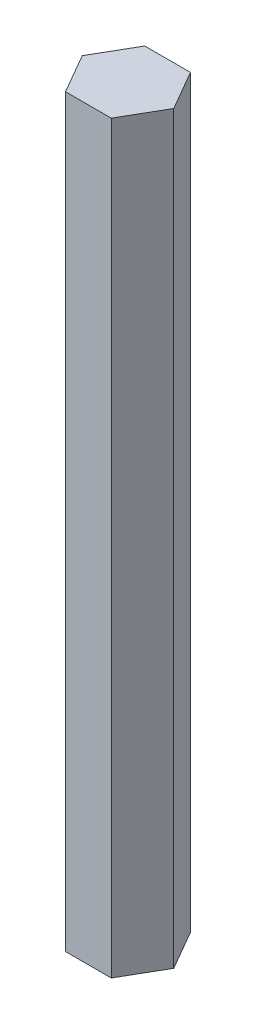
ISO-10303-21;
HEADER;
FILE_DESCRIPTION(('STEP AP214'),'2;1');
FILE_NAME('part.step','',(''),(''),'','','');
FILE_SCHEMA(('AUTOMOTIVE_DESIGN { 1 0 10303 214 1 1 1 1 }'));
ENDSEC;
DATA;
#1=APPLICATION_CONTEXT('core data for automotive mechanical design processes');
#2=APPLICATION_PROTOCOL_DEFINITION('international standard','automotive_design',2000,#1);
#3=PRODUCT_CONTEXT('',#1,'mechanical');
#4=PRODUCT('Part','Part','',(#3));
#5=PRODUCT_RELATED_PRODUCT_CATEGORY('part','',(#4));
#6=PRODUCT_DEFINITION_FORMATION('','',#4);
#7=PRODUCT_DEFINITION_CONTEXT('part definition',#1,'design');
#8=PRODUCT_DEFINITION('design','',#6,#7);
#9=PRODUCT_DEFINITION_SHAPE('','',#8);
#10=(LENGTH_UNIT() NAMED_UNIT(*) SI_UNIT(.MILLI.,.METRE.));
#11=(NAMED_UNIT(*) PLANE_ANGLE_UNIT() SI_UNIT($,.RADIAN.));
#12=(NAMED_UNIT(*) SI_UNIT($,.STERADIAN.) SOLID_ANGLE_UNIT());
#13=UNCERTAINTY_MEASURE_WITH_UNIT(LENGTH_MEASURE(1.E-05),#10,'distance_accuracy_value','');
#14=(GEOMETRIC_REPRESENTATION_CONTEXT(3) GLOBAL_UNCERTAINTY_ASSIGNED_CONTEXT((#13)) GLOBAL_UNIT_ASSIGNED_CONTEXT((#10,
#11,#12)) REPRESENTATION_CONTEXT('',''));
#15=CARTESIAN_POINT('',(0.,0.,0.));
#16=DIRECTION('',(0.,0.,1.));
#17=DIRECTION('',(1.,0.,0.));
#18=AXIS2_PLACEMENT_3D('',#15,#16,#17);
#19=CARTESIAN_POINT('',(2.88675134594813,47.,0.));
#20=DIRECTION('',(-0.866025403784438,0.,0.5));
#21=DIRECTION('',(0.5,0.,0.866025403784439));
#22=AXIS2_PLACEMENT_3D('',#19,#20,#21);
#23=PLANE('',#22);
#24=DIRECTION('',(-0.5,0.,-0.866025403784438));
#25=VECTOR('',#24,1.);
#26=CARTESIAN_POINT('',(2.88675134594813,0.,0.));
#27=LINE('',#26,#25);
#28=CARTESIAN_POINT('',(2.88675134594813,0.,0.));
#29=VERTEX_POINT('',#28);
#30=CARTESIAN_POINT('',(1.44337567297406,0.,-2.5));
#31=VERTEX_POINT('',#30);
#32=EDGE_CURVE('E134',#29,#31,#27,.T.);
#33=ORIENTED_EDGE('',*,*,#32,.T.);
#34=DIRECTION('',(0.,-1.,0.));
#35=VECTOR('',#34,1.);
#36=CARTESIAN_POINT('',(1.44337567297406,47.,-2.5));
#37=LINE('',#36,#35);
#38=CARTESIAN_POINT('',(1.44337567297406,47.,-2.5));
#39=VERTEX_POINT('',#38);
#40=EDGE_CURVE('E11',#39,#31,#37,.T.);
#41=ORIENTED_EDGE('',*,*,#40,.F.);
#42=DIRECTION('',(-0.5,0.,-0.866025403784438));
#43=VECTOR('',#42,1.);
#44=CARTESIAN_POINT('',(2.88675134594813,47.,0.));
#45=LINE('',#44,#43);
#46=CARTESIAN_POINT('',(2.88675134594813,47.,0.));
#47=VERTEX_POINT('',#46);
#48=EDGE_CURVE('E150',#47,#39,#45,.T.);
#49=ORIENTED_EDGE('',*,*,#48,.F.);
#50=DIRECTION('',(0.,-1.,0.));
#51=VECTOR('',#50,1.);
#52=CARTESIAN_POINT('',(2.88675134594813,47.,0.));
#53=LINE('',#52,#51);
#54=EDGE_CURVE('E130',#47,#29,#53,.T.);
#55=ORIENTED_EDGE('',*,*,#54,.T.);
#56=EDGE_LOOP('',(#33,#41,#49,#55));
#57=FACE_BOUND('',#56,.T.);
#58=ADVANCED_FACE('F45',(#57),#23,.F.);
#59=CARTESIAN_POINT('',(1.44337567297406,47.,-2.5));
#60=DIRECTION('',(0.,0.,1.));
#61=DIRECTION('',(1.,0.,0.));
#62=AXIS2_PLACEMENT_3D('',#59,#60,#61);
#63=PLANE('',#62);
#64=DIRECTION('',(-1.,0.,0.));
#65=VECTOR('',#64,1.);
#66=CARTESIAN_POINT('',(1.44337567297406,0.,-2.5));
#67=LINE('',#66,#65);
#68=CARTESIAN_POINT('',(-1.44337567297406,0.,-2.5));
#69=VERTEX_POINT('',#68);
#70=EDGE_CURVE('E138',#31,#69,#67,.T.);
#71=ORIENTED_EDGE('',*,*,#70,.T.);
#72=DIRECTION('',(0.,-1.,0.));
#73=VECTOR('',#72,1.);
#74=CARTESIAN_POINT('',(-1.44337567297406,47.,-2.5));
#75=LINE('',#74,#73);
#76=CARTESIAN_POINT('',(-1.44337567297406,47.,-2.5));
#77=VERTEX_POINT('',#76);
#78=EDGE_CURVE('E54',#77,#69,#75,.T.);
#79=ORIENTED_EDGE('',*,*,#78,.F.);
#80=DIRECTION('',(-1.,0.,0.));
#81=VECTOR('',#80,1.);
#82=CARTESIAN_POINT('',(1.44337567297406,47.,-2.5));
#83=LINE('',#82,#81);
#84=EDGE_CURVE('E99',#39,#77,#83,.T.);
#85=ORIENTED_EDGE('',*,*,#84,.F.);
#86=ORIENTED_EDGE('',*,*,#40,.T.);
#87=EDGE_LOOP('',(#71,#79,#85,#86));
#88=FACE_BOUND('',#87,.T.);
#89=ADVANCED_FACE('F178',(#88),#63,.F.);
#90=CARTESIAN_POINT('',(-1.44337567297406,47.,-2.5));
#91=DIRECTION('',(0.866025403784439,0.,0.5));
#92=DIRECTION('',(0.5,0.,-0.866025403784439));
#93=AXIS2_PLACEMENT_3D('',#90,#91,#92);
#94=PLANE('',#93);
#95=DIRECTION('',(-0.5,0.,0.866025403784439));
#96=VECTOR('',#95,1.);
#97=CARTESIAN_POINT('',(-1.44337567297406,0.,-2.5));
#98=LINE('',#97,#96);
#99=CARTESIAN_POINT('',(-2.88675134594813,0.,0.));
#100=VERTEX_POINT('',#99);
#101=EDGE_CURVE('E141',#69,#100,#98,.T.);
#102=ORIENTED_EDGE('',*,*,#101,.T.);
#103=DIRECTION('',(0.,-1.,0.));
#104=VECTOR('',#103,1.);
#105=CARTESIAN_POINT('',(-2.88675134594813,47.,0.));
#106=LINE('',#105,#104);
#107=CARTESIAN_POINT('',(-2.88675134594813,47.,0.));
#108=VERTEX_POINT('',#107);
#109=EDGE_CURVE('E123',#108,#100,#106,.T.);
#110=ORIENTED_EDGE('',*,*,#109,.F.);
#111=DIRECTION('',(-0.5,0.,0.866025403784439));
#112=VECTOR('',#111,1.);
#113=CARTESIAN_POINT('',(-1.44337567297406,47.,-2.5));
#114=LINE('',#113,#112);
#115=EDGE_CURVE('E112',#77,#108,#114,.T.);
#116=ORIENTED_EDGE('',*,*,#115,.F.);
#117=ORIENTED_EDGE('',*,*,#78,.T.);
#118=EDGE_LOOP('',(#102,#110,#116,#117));
#119=FACE_BOUND('',#118,.T.);
#120=ADVANCED_FACE('F160',(#119),#94,.F.);
#121=CARTESIAN_POINT('',(-2.88675134594813,47.,0.));
#122=DIRECTION('',(0.866025403784438,0.,-0.5));
#123=DIRECTION('',(-0.5,0.,-0.866025403784439));
#124=AXIS2_PLACEMENT_3D('',#121,#122,#123);
#125=PLANE('',#124);
#126=DIRECTION('',(0.5,0.,0.866025403784438));
#127=VECTOR('',#126,1.);
#128=CARTESIAN_POINT('',(-2.88675134594813,0.,0.));
#129=LINE('',#128,#127);
#130=CARTESIAN_POINT('',(-1.44337567297406,0.,2.5));
#131=VERTEX_POINT('',#130);
#132=EDGE_CURVE('E121',#100,#131,#129,.T.);
#133=ORIENTED_EDGE('',*,*,#132,.T.);
#134=DIRECTION('',(0.,-1.,0.));
#135=VECTOR('',#134,1.);
#136=CARTESIAN_POINT('',(-1.44337567297406,47.,2.5));
#137=LINE('',#136,#135);
#138=CARTESIAN_POINT('',(-1.44337567297406,47.,2.5));
#139=VERTEX_POINT('',#138);
#140=EDGE_CURVE('E118',#139,#131,#137,.T.);
#141=ORIENTED_EDGE('',*,*,#140,.F.);
#142=DIRECTION('',(0.5,0.,0.866025403784438));
#143=VECTOR('',#142,1.);
#144=CARTESIAN_POINT('',(-2.88675134594813,47.,0.));
#145=LINE('',#144,#143);
#146=EDGE_CURVE('E106',#108,#139,#145,.T.);
#147=ORIENTED_EDGE('',*,*,#146,.F.);
#148=ORIENTED_EDGE('',*,*,#109,.T.);
#149=EDGE_LOOP('',(#133,#141,#147,#148));
#150=FACE_BOUND('',#149,.T.);
#151=ADVANCED_FACE('F119',(#150),#125,.F.);
#152=CARTESIAN_POINT('',(-1.44337567297406,47.,2.5));
#153=DIRECTION('',(0.,0.,-1.));
#154=DIRECTION('',(-1.,0.,0.));
#155=AXIS2_PLACEMENT_3D('',#152,#153,#154);
#156=PLANE('',#155);
#157=DIRECTION('',(1.,0.,0.));
#158=VECTOR('',#157,1.);
#159=CARTESIAN_POINT('',(-1.44337567297406,0.,2.5));
#160=LINE('',#159,#158);
#161=CARTESIAN_POINT('',(1.44337567297407,0.,2.5));
#162=VERTEX_POINT('',#161);
#163=EDGE_CURVE('E85',#131,#162,#160,.T.);
#164=ORIENTED_EDGE('',*,*,#163,.T.);
#165=DIRECTION('',(0.,-1.,0.));
#166=VECTOR('',#165,1.);
#167=CARTESIAN_POINT('',(1.44337567297407,47.,2.5));
#168=LINE('',#167,#166);
#169=CARTESIAN_POINT('',(1.44337567297407,47.,2.5));
#170=VERTEX_POINT('',#169);
#171=EDGE_CURVE('E124',#170,#162,#168,.T.);
#172=ORIENTED_EDGE('',*,*,#171,.F.);
#173=DIRECTION('',(1.,0.,0.));
#174=VECTOR('',#173,1.);
#175=CARTESIAN_POINT('',(-1.44337567297406,47.,2.5));
#176=LINE('',#175,#174);
#177=EDGE_CURVE('E110',#139,#170,#176,.T.);
#178=ORIENTED_EDGE('',*,*,#177,.F.);
#179=ORIENTED_EDGE('',*,*,#140,.T.);
#180=EDGE_LOOP('',(#164,#172,#178,#179));
#181=FACE_BOUND('',#180,.T.);
#182=ADVANCED_FACE('F126',(#181),#156,.F.);
#183=CARTESIAN_POINT('',(1.44337567297407,47.,2.5));
#184=DIRECTION('',(-0.866025403784439,0.,-0.5));
#185=DIRECTION('',(-0.5,0.,0.866025403784439));
#186=AXIS2_PLACEMENT_3D('',#183,#184,#185);
#187=PLANE('',#186);
#188=DIRECTION('',(0.5,0.,-0.866025403784439));
#189=VECTOR('',#188,1.);
#190=CARTESIAN_POINT('',(1.44337567297407,0.,2.5));
#191=LINE('',#190,#189);
#192=EDGE_CURVE('E91',#162,#29,#191,.T.);
#193=ORIENTED_EDGE('',*,*,#192,.T.);
#194=ORIENTED_EDGE('',*,*,#54,.F.);
#195=DIRECTION('',(0.5,0.,-0.866025403784439));
#196=VECTOR('',#195,1.);
#197=CARTESIAN_POINT('',(1.44337567297407,47.,2.5));
#198=LINE('',#197,#196);
#199=EDGE_CURVE('E62',#170,#47,#198,.T.);
#200=ORIENTED_EDGE('',*,*,#199,.F.);
#201=ORIENTED_EDGE('',*,*,#171,.T.);
#202=EDGE_LOOP('',(#193,#194,#200,#201));
#203=FACE_BOUND('',#202,.T.);
#204=ADVANCED_FACE('F167',(#203),#187,.F.);
#205=CARTESIAN_POINT('',(0.,47.,0.));
#206=DIRECTION('',(0.,1.,0.));
#207=DIRECTION('',(0.,0.,1.));
#208=AXIS2_PLACEMENT_3D('',#205,#206,#207);
#209=PLANE('',#208);
#210=ORIENTED_EDGE('',*,*,#48,.T.);
#211=ORIENTED_EDGE('',*,*,#84,.T.);
#212=ORIENTED_EDGE('',*,*,#115,.T.);
#213=ORIENTED_EDGE('',*,*,#146,.T.);
#214=ORIENTED_EDGE('',*,*,#177,.T.);
#215=ORIENTED_EDGE('',*,*,#199,.T.);
#216=EDGE_LOOP('',(#210,#211,#212,#213,#214,#215));
#217=FACE_BOUND('',#216,.T.);
#218=ADVANCED_FACE('F108',(#217),#209,.T.);
#219=CARTESIAN_POINT('',(0.,0.,0.));
#220=DIRECTION('',(0.,1.,0.));
#221=DIRECTION('',(0.,0.,1.));
#222=AXIS2_PLACEMENT_3D('',#219,#220,#221);
#223=PLANE('',#222);
#224=ORIENTED_EDGE('',*,*,#32,.F.);
#225=ORIENTED_EDGE('',*,*,#192,.F.);
#226=ORIENTED_EDGE('',*,*,#163,.F.);
#227=ORIENTED_EDGE('',*,*,#132,.F.);
#228=ORIENTED_EDGE('',*,*,#101,.F.);
#229=ORIENTED_EDGE('',*,*,#70,.F.);
#230=EDGE_LOOP('',(#224,#225,#226,#227,#228,#229));
#231=FACE_BOUND('',#230,.T.);
#232=ADVANCED_FACE('F163',(#231),#223,.F.);
#233=CLOSED_SHELL('',(#58,#89,#120,#151,#182,#204,#218,#232));
#234=MANIFOLD_SOLID_BREP('B2',#233);
#235=ADVANCED_BREP_SHAPE_REPRESENTATION('',(#18,#234),#14);
#236=SHAPE_DEFINITION_REPRESENTATION(#9,#235);
ENDSEC;
END-ISO-10303-21;
